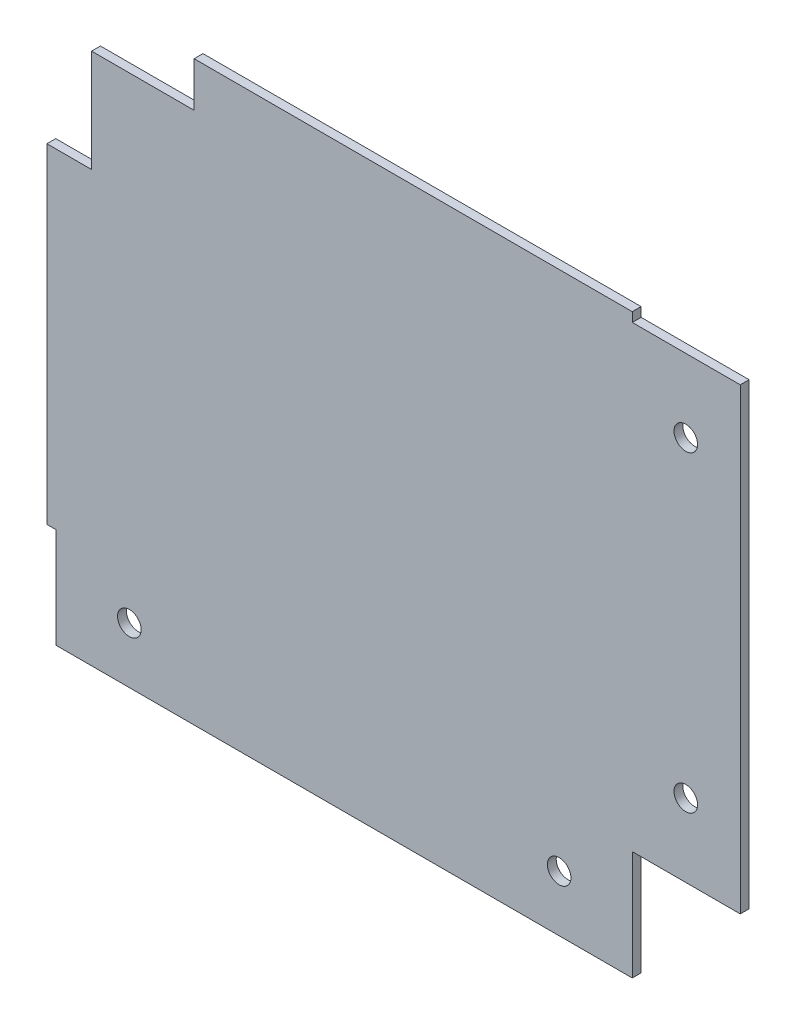
ISO-10303-21;
HEADER;
FILE_DESCRIPTION(('STEP AP214'),'2;1');
FILE_NAME('part.step','',(''),(''),'','','');
FILE_SCHEMA(('AUTOMOTIVE_DESIGN { 1 0 10303 214 1 1 1 1 }'));
ENDSEC;
DATA;
#1=APPLICATION_CONTEXT('core data for automotive mechanical design processes');
#2=APPLICATION_PROTOCOL_DEFINITION('international standard','automotive_design',2000,#1);
#3=PRODUCT_CONTEXT('',#1,'mechanical');
#4=PRODUCT('Part','Part','',(#3));
#5=PRODUCT_RELATED_PRODUCT_CATEGORY('part','',(#4));
#6=PRODUCT_DEFINITION_FORMATION('','',#4);
#7=PRODUCT_DEFINITION_CONTEXT('part definition',#1,'design');
#8=PRODUCT_DEFINITION('design','',#6,#7);
#9=PRODUCT_DEFINITION_SHAPE('','',#8);
#10=(LENGTH_UNIT() NAMED_UNIT(*) SI_UNIT(.MILLI.,.METRE.));
#11=(NAMED_UNIT(*) PLANE_ANGLE_UNIT() SI_UNIT($,.RADIAN.));
#12=(NAMED_UNIT(*) SI_UNIT($,.STERADIAN.) SOLID_ANGLE_UNIT());
#13=UNCERTAINTY_MEASURE_WITH_UNIT(LENGTH_MEASURE(1.E-05),#10,'distance_accuracy_value','');
#14=(GEOMETRIC_REPRESENTATION_CONTEXT(3) GLOBAL_UNCERTAINTY_ASSIGNED_CONTEXT((#13)) GLOBAL_UNIT_ASSIGNED_CONTEXT((#10,
#11,#12)) REPRESENTATION_CONTEXT('',''));
#15=CARTESIAN_POINT('',(0.,0.,0.));
#16=DIRECTION('',(0.,0.,1.));
#17=DIRECTION('',(1.,0.,0.));
#18=AXIS2_PLACEMENT_3D('',#15,#16,#17);
#19=CARTESIAN_POINT('',(0.,0.,3.));
#20=DIRECTION('',(0.,0.,-1.));
#21=DIRECTION('',(-1.,0.,0.));
#22=AXIS2_PLACEMENT_3D('',#19,#20,#21);
#23=PLANE('',#22);
#24=DIRECTION('',(0.,-1.,0.));
#25=VECTOR('',#24,1.);
#26=CARTESIAN_POINT('',(0.,0.,3.));
#27=LINE('',#26,#25);
#28=CARTESIAN_POINT('',(0.,34.005,3.));
#29=VERTEX_POINT('',#28);
#30=CARTESIAN_POINT('',(0.,0.,3.));
#31=VERTEX_POINT('',#30);
#32=EDGE_CURVE('E194',#29,#31,#27,.T.);
#33=ORIENTED_EDGE('',*,*,#32,.T.);
#34=DIRECTION('',(1.,0.,0.));
#35=VECTOR('',#34,1.);
#36=CARTESIAN_POINT('',(0.,0.,3.));
#37=LINE('',#36,#35);
#38=CARTESIAN_POINT('',(195.645,0.,3.));
#39=VERTEX_POINT('',#38);
#40=EDGE_CURVE('E112',#31,#39,#37,.T.);
#41=ORIENTED_EDGE('',*,*,#40,.T.);
#42=DIRECTION('',(0.,1.,0.));
#43=VECTOR('',#42,1.);
#44=CARTESIAN_POINT('',(195.645,0.,3.));
#45=LINE('',#44,#43);
#46=CARTESIAN_POINT('',(195.645,37.18,3.));
#47=VERTEX_POINT('',#46);
#48=EDGE_CURVE('E227',#39,#47,#45,.T.);
#49=ORIENTED_EDGE('',*,*,#48,.T.);
#50=DIRECTION('',(1.,0.,0.));
#51=VECTOR('',#50,1.);
#52=CARTESIAN_POINT('',(195.645,37.18,3.));
#53=LINE('',#52,#51);
#54=CARTESIAN_POINT('',(232.325,37.18,3.));
#55=VERTEX_POINT('',#54);
#56=EDGE_CURVE('E246',#47,#55,#53,.T.);
#57=ORIENTED_EDGE('',*,*,#56,.T.);
#58=DIRECTION('',(0.,1.,0.));
#59=VECTOR('',#58,1.);
#60=CARTESIAN_POINT('',(232.325,37.18,3.));
#61=LINE('',#60,#59);
#62=CARTESIAN_POINT('',(232.325,192.825,3.));
#63=VERTEX_POINT('',#62);
#64=EDGE_CURVE('E243',#55,#63,#61,.T.);
#65=ORIENTED_EDGE('',*,*,#64,.T.);
#66=DIRECTION('',(-1.,0.,0.));
#67=VECTOR('',#66,1.);
#68=CARTESIAN_POINT('',(232.325,192.825,3.));
#69=LINE('',#68,#67);
#70=CARTESIAN_POINT('',(195.645,192.825,3.));
#71=VERTEX_POINT('',#70);
#72=EDGE_CURVE('E245',#63,#71,#69,.T.);
#73=ORIENTED_EDGE('',*,*,#72,.T.);
#74=DIRECTION('',(0.,1.,0.));
#75=VECTOR('',#74,1.);
#76=CARTESIAN_POINT('',(195.645,192.825,3.));
#77=LINE('',#76,#75);
#78=CARTESIAN_POINT('',(195.645,196.,3.));
#79=VERTEX_POINT('',#78);
#80=EDGE_CURVE('E248',#71,#79,#77,.T.);
#81=ORIENTED_EDGE('',*,*,#80,.T.);
#82=DIRECTION('',(-1.,0.,0.));
#83=VECTOR('',#82,1.);
#84=CARTESIAN_POINT('',(46.835,196.,3.));
#85=LINE('',#84,#83);
#86=CARTESIAN_POINT('',(46.835,196.,3.));
#87=VERTEX_POINT('',#86);
#88=EDGE_CURVE('E254',#79,#87,#85,.T.);
#89=ORIENTED_EDGE('',*,*,#88,.T.);
#90=DIRECTION('',(0.,-1.,0.));
#91=VECTOR('',#90,1.);
#92=CARTESIAN_POINT('',(46.835,196.,3.));
#93=LINE('',#92,#91);
#94=CARTESIAN_POINT('',(46.835,180.82,3.));
#95=VERTEX_POINT('',#94);
#96=EDGE_CURVE('E256',#87,#95,#93,.T.);
#97=ORIENTED_EDGE('',*,*,#96,.T.);
#98=DIRECTION('',(-1.,0.,0.));
#99=VECTOR('',#98,1.);
#100=CARTESIAN_POINT('',(46.835,180.82,3.));
#101=LINE('',#100,#99);
#102=CARTESIAN_POINT('',(12.005,180.82,3.));
#103=VERTEX_POINT('',#102);
#104=EDGE_CURVE('E258',#95,#103,#101,.T.);
#105=ORIENTED_EDGE('',*,*,#104,.T.);
#106=DIRECTION('',(0.,-1.,0.));
#107=VECTOR('',#106,1.);
#108=CARTESIAN_POINT('',(12.005,180.82,3.));
#109=LINE('',#108,#107);
#110=CARTESIAN_POINT('',(12.005,145.99,3.));
#111=VERTEX_POINT('',#110);
#112=EDGE_CURVE('E149',#103,#111,#109,.T.);
#113=ORIENTED_EDGE('',*,*,#112,.T.);
#114=DIRECTION('',(-1.,0.,0.));
#115=VECTOR('',#114,1.);
#116=CARTESIAN_POINT('',(-3.175,145.99,3.));
#117=LINE('',#116,#115);
#118=CARTESIAN_POINT('',(-3.175,145.99,3.));
#119=VERTEX_POINT('',#118);
#120=EDGE_CURVE('E143',#111,#119,#117,.T.);
#121=ORIENTED_EDGE('',*,*,#120,.T.);
#122=DIRECTION('',(0.,-1.,0.));
#123=VECTOR('',#122,1.);
#124=CARTESIAN_POINT('',(-3.175,34.005,3.));
#125=LINE('',#124,#123);
#126=CARTESIAN_POINT('',(-3.175,34.005,3.));
#127=VERTEX_POINT('',#126);
#128=EDGE_CURVE('E147',#119,#127,#125,.T.);
#129=ORIENTED_EDGE('',*,*,#128,.T.);
#130=DIRECTION('',(1.,0.,0.));
#131=VECTOR('',#130,1.);
#132=CARTESIAN_POINT('',(-3.175,34.005,3.));
#133=LINE('',#132,#131);
#134=EDGE_CURVE('E51',#127,#29,#133,.T.);
#135=ORIENTED_EDGE('',*,*,#134,.T.);
#136=EDGE_LOOP('',(#33,#41,#49,#57,#65,#73,#81,#89,#97,#105,#113,#121,#129,#135));
#137=FACE_BOUND('',#136,.T.);
#138=CARTESIAN_POINT('',(170.815,19.005,3.));
#139=DIRECTION('',(0.,0.,1.));
#140=DIRECTION('',(1.,0.,0.));
#141=AXIS2_PLACEMENT_3D('',#138,#139,#140);
#142=CIRCLE('',#141,3.99999999999999);
#143=CARTESIAN_POINT('',(174.815,19.005,3.));
#144=VERTEX_POINT('',#143);
#145=EDGE_CURVE('E171',#144,#144,#142,.T.);
#146=ORIENTED_EDGE('',*,*,#145,.F.);
#147=EDGE_LOOP('',(#146));
#148=FACE_BOUND('',#147,.T.);
#149=CARTESIAN_POINT('',(24.83,19.005,3.));
#150=DIRECTION('',(0.,0.,1.));
#151=DIRECTION('',(1.,0.,0.));
#152=AXIS2_PLACEMENT_3D('',#149,#150,#151);
#153=CIRCLE('',#152,4.);
#154=CARTESIAN_POINT('',(28.83,19.005,3.));
#155=VERTEX_POINT('',#154);
#156=EDGE_CURVE('E322',#155,#155,#153,.T.);
#157=ORIENTED_EDGE('',*,*,#156,.F.);
#158=EDGE_LOOP('',(#157));
#159=FACE_BOUND('',#158,.T.);
#160=CARTESIAN_POINT('',(213.82,167.995,3.));
#161=DIRECTION('',(0.,0.,1.));
#162=DIRECTION('',(1.,0.,0.));
#163=AXIS2_PLACEMENT_3D('',#160,#161,#162);
#164=CIRCLE('',#163,3.99999999999999);
#165=CARTESIAN_POINT('',(217.82,167.995,3.));
#166=VERTEX_POINT('',#165);
#167=EDGE_CURVE('E316',#166,#166,#164,.T.);
#168=ORIENTED_EDGE('',*,*,#167,.F.);
#169=EDGE_LOOP('',(#168));
#170=FACE_BOUND('',#169,.T.);
#171=CARTESIAN_POINT('',(213.82,62.01,3.));
#172=DIRECTION('',(0.,0.,1.));
#173=DIRECTION('',(1.,0.,0.));
#174=AXIS2_PLACEMENT_3D('',#171,#172,#173);
#175=CIRCLE('',#174,3.99999999999999);
#176=CARTESIAN_POINT('',(217.82,62.01,3.));
#177=VERTEX_POINT('',#176);
#178=EDGE_CURVE('E307',#177,#177,#175,.T.);
#179=ORIENTED_EDGE('',*,*,#178,.F.);
#180=EDGE_LOOP('',(#179));
#181=FACE_BOUND('',#180,.T.);
#182=ADVANCED_FACE('F34',(#137,#148,#159,#170,#181),#23,.F.);
#183=CARTESIAN_POINT('',(0.,0.,0.));
#184=DIRECTION('',(0.,0.,-1.));
#185=DIRECTION('',(-1.,0.,0.));
#186=AXIS2_PLACEMENT_3D('',#183,#184,#185);
#187=PLANE('',#186);
#188=CARTESIAN_POINT('',(213.82,167.995,0.));
#189=DIRECTION('',(0.,0.,1.));
#190=DIRECTION('',(1.,0.,0.));
#191=AXIS2_PLACEMENT_3D('',#188,#189,#190);
#192=CIRCLE('',#191,3.99999999999999);
#193=CARTESIAN_POINT('',(217.82,167.995,0.));
#194=VERTEX_POINT('',#193);
#195=EDGE_CURVE('E313',#194,#194,#192,.T.);
#196=ORIENTED_EDGE('',*,*,#195,.T.);
#197=EDGE_LOOP('',(#196));
#198=FACE_BOUND('',#197,.T.);
#199=CARTESIAN_POINT('',(170.815,19.005,0.));
#200=DIRECTION('',(0.,0.,1.));
#201=DIRECTION('',(1.,0.,0.));
#202=AXIS2_PLACEMENT_3D('',#199,#200,#201);
#203=CIRCLE('',#202,3.99999999999999);
#204=CARTESIAN_POINT('',(174.815,19.005,0.));
#205=VERTEX_POINT('',#204);
#206=EDGE_CURVE('E325',#205,#205,#203,.T.);
#207=ORIENTED_EDGE('',*,*,#206,.T.);
#208=EDGE_LOOP('',(#207));
#209=FACE_BOUND('',#208,.T.);
#210=DIRECTION('',(0.,-1.,0.));
#211=VECTOR('',#210,1.);
#212=CARTESIAN_POINT('',(0.,0.,0.));
#213=LINE('',#212,#211);
#214=CARTESIAN_POINT('',(0.,34.005,0.));
#215=VERTEX_POINT('',#214);
#216=CARTESIAN_POINT('',(0.,0.,0.));
#217=VERTEX_POINT('',#216);
#218=EDGE_CURVE('E167',#215,#217,#213,.T.);
#219=ORIENTED_EDGE('',*,*,#218,.F.);
#220=DIRECTION('',(1.,0.,0.));
#221=VECTOR('',#220,1.);
#222=CARTESIAN_POINT('',(-3.175,34.005,0.));
#223=LINE('',#222,#221);
#224=CARTESIAN_POINT('',(-3.175,34.005,0.));
#225=VERTEX_POINT('',#224);
#226=EDGE_CURVE('E104',#225,#215,#223,.T.);
#227=ORIENTED_EDGE('',*,*,#226,.F.);
#228=DIRECTION('',(0.,-1.,0.));
#229=VECTOR('',#228,1.);
#230=CARTESIAN_POINT('',(-3.175,34.005,0.));
#231=LINE('',#230,#229);
#232=CARTESIAN_POINT('',(-3.175,145.99,0.));
#233=VERTEX_POINT('',#232);
#234=EDGE_CURVE('E98',#233,#225,#231,.T.);
#235=ORIENTED_EDGE('',*,*,#234,.F.);
#236=DIRECTION('',(-1.,0.,0.));
#237=VECTOR('',#236,1.);
#238=CARTESIAN_POINT('',(-3.175,145.99,0.));
#239=LINE('',#238,#237);
#240=CARTESIAN_POINT('',(12.005,145.99,0.));
#241=VERTEX_POINT('',#240);
#242=EDGE_CURVE('E157',#241,#233,#239,.T.);
#243=ORIENTED_EDGE('',*,*,#242,.F.);
#244=DIRECTION('',(0.,-1.,0.));
#245=VECTOR('',#244,1.);
#246=CARTESIAN_POINT('',(12.005,180.82,0.));
#247=LINE('',#246,#245);
#248=CARTESIAN_POINT('',(12.005,180.82,0.));
#249=VERTEX_POINT('',#248);
#250=EDGE_CURVE('E189',#249,#241,#247,.T.);
#251=ORIENTED_EDGE('',*,*,#250,.F.);
#252=DIRECTION('',(-1.,0.,0.));
#253=VECTOR('',#252,1.);
#254=CARTESIAN_POINT('',(46.835,180.82,0.));
#255=LINE('',#254,#253);
#256=CARTESIAN_POINT('',(46.835,180.82,0.));
#257=VERTEX_POINT('',#256);
#258=EDGE_CURVE('E187',#257,#249,#255,.T.);
#259=ORIENTED_EDGE('',*,*,#258,.F.);
#260=DIRECTION('',(0.,-1.,0.));
#261=VECTOR('',#260,1.);
#262=CARTESIAN_POINT('',(46.835,196.,0.));
#263=LINE('',#262,#261);
#264=CARTESIAN_POINT('',(46.835,196.,0.));
#265=VERTEX_POINT('',#264);
#266=EDGE_CURVE('E185',#265,#257,#263,.T.);
#267=ORIENTED_EDGE('',*,*,#266,.F.);
#268=DIRECTION('',(-1.,0.,0.));
#269=VECTOR('',#268,1.);
#270=CARTESIAN_POINT('',(46.835,196.,0.));
#271=LINE('',#270,#269);
#272=CARTESIAN_POINT('',(195.645,196.,0.));
#273=VERTEX_POINT('',#272);
#274=EDGE_CURVE('E183',#273,#265,#271,.T.);
#275=ORIENTED_EDGE('',*,*,#274,.F.);
#276=DIRECTION('',(0.,1.,0.));
#277=VECTOR('',#276,1.);
#278=CARTESIAN_POINT('',(195.645,192.825,0.));
#279=LINE('',#278,#277);
#280=CARTESIAN_POINT('',(195.645,192.825,0.));
#281=VERTEX_POINT('',#280);
#282=EDGE_CURVE('E181',#281,#273,#279,.T.);
#283=ORIENTED_EDGE('',*,*,#282,.F.);
#284=DIRECTION('',(-1.,0.,0.));
#285=VECTOR('',#284,1.);
#286=CARTESIAN_POINT('',(232.325,192.825,0.));
#287=LINE('',#286,#285);
#288=CARTESIAN_POINT('',(232.325,192.825,0.));
#289=VERTEX_POINT('',#288);
#290=EDGE_CURVE('E179',#289,#281,#287,.T.);
#291=ORIENTED_EDGE('',*,*,#290,.F.);
#292=DIRECTION('',(0.,1.,0.));
#293=VECTOR('',#292,1.);
#294=CARTESIAN_POINT('',(232.325,37.18,0.));
#295=LINE('',#294,#293);
#296=CARTESIAN_POINT('',(232.325,37.18,0.));
#297=VERTEX_POINT('',#296);
#298=EDGE_CURVE('E177',#297,#289,#295,.T.);
#299=ORIENTED_EDGE('',*,*,#298,.F.);
#300=DIRECTION('',(1.,0.,0.));
#301=VECTOR('',#300,1.);
#302=CARTESIAN_POINT('',(195.645,37.18,0.));
#303=LINE('',#302,#301);
#304=CARTESIAN_POINT('',(195.645,37.18,0.));
#305=VERTEX_POINT('',#304);
#306=EDGE_CURVE('E175',#305,#297,#303,.T.);
#307=ORIENTED_EDGE('',*,*,#306,.F.);
#308=DIRECTION('',(0.,1.,0.));
#309=VECTOR('',#308,1.);
#310=CARTESIAN_POINT('',(195.645,0.,0.));
#311=LINE('',#310,#309);
#312=CARTESIAN_POINT('',(195.645,0.,0.));
#313=VERTEX_POINT('',#312);
#314=EDGE_CURVE('E173',#313,#305,#311,.T.);
#315=ORIENTED_EDGE('',*,*,#314,.F.);
#316=DIRECTION('',(1.,0.,0.));
#317=VECTOR('',#316,1.);
#318=CARTESIAN_POINT('',(0.,0.,0.));
#319=LINE('',#318,#317);
#320=EDGE_CURVE('E170',#217,#313,#319,.T.);
#321=ORIENTED_EDGE('',*,*,#320,.F.);
#322=EDGE_LOOP('',(#219,#227,#235,#243,#251,#259,#267,#275,#283,#291,#299,#307,#315,#321));
#323=FACE_BOUND('',#322,.T.);
#324=CARTESIAN_POINT('',(24.83,19.005,0.));
#325=DIRECTION('',(0.,0.,1.));
#326=DIRECTION('',(1.,0.,0.));
#327=AXIS2_PLACEMENT_3D('',#324,#325,#326);
#328=CIRCLE('',#327,4.);
#329=CARTESIAN_POINT('',(28.83,19.005,0.));
#330=VERTEX_POINT('',#329);
#331=EDGE_CURVE('E319',#330,#330,#328,.T.);
#332=ORIENTED_EDGE('',*,*,#331,.T.);
#333=EDGE_LOOP('',(#332));
#334=FACE_BOUND('',#333,.T.);
#335=CARTESIAN_POINT('',(213.82,62.01,0.));
#336=DIRECTION('',(0.,0.,1.));
#337=DIRECTION('',(1.,0.,0.));
#338=AXIS2_PLACEMENT_3D('',#335,#336,#337);
#339=CIRCLE('',#338,3.99999999999999);
#340=CARTESIAN_POINT('',(217.82,62.01,0.));
#341=VERTEX_POINT('',#340);
#342=EDGE_CURVE('E310',#341,#341,#339,.T.);
#343=ORIENTED_EDGE('',*,*,#342,.T.);
#344=EDGE_LOOP('',(#343));
#345=FACE_BOUND('',#344,.T.);
#346=ADVANCED_FACE('F231',(#198,#209,#323,#334,#345),#187,.T.);
#347=CARTESIAN_POINT('',(0.,0.,3.));
#348=DIRECTION('',(1.,0.,0.));
#349=DIRECTION('',(0.,0.,-1.));
#350=AXIS2_PLACEMENT_3D('',#347,#348,#349);
#351=PLANE('',#350);
#352=ORIENTED_EDGE('',*,*,#218,.T.);
#353=DIRECTION('',(0.,0.,-1.));
#354=VECTOR('',#353,1.);
#355=CARTESIAN_POINT('',(0.,0.,3.));
#356=LINE('',#355,#354);
#357=EDGE_CURVE('E11',#31,#217,#356,.T.);
#358=ORIENTED_EDGE('',*,*,#357,.F.);
#359=ORIENTED_EDGE('',*,*,#32,.F.);
#360=DIRECTION('',(0.,0.,-1.));
#361=VECTOR('',#360,1.);
#362=CARTESIAN_POINT('',(0.,34.005,3.));
#363=LINE('',#362,#361);
#364=EDGE_CURVE('E163',#29,#215,#363,.T.);
#365=ORIENTED_EDGE('',*,*,#364,.T.);
#366=EDGE_LOOP('',(#352,#358,#359,#365));
#367=FACE_BOUND('',#366,.T.);
#368=ADVANCED_FACE('F36',(#367),#351,.F.);
#369=CARTESIAN_POINT('',(0.,0.,3.));
#370=DIRECTION('',(0.,1.,0.));
#371=DIRECTION('',(0.,0.,1.));
#372=AXIS2_PLACEMENT_3D('',#369,#370,#371);
#373=PLANE('',#372);
#374=ORIENTED_EDGE('',*,*,#320,.T.);
#375=DIRECTION('',(0.,0.,-1.));
#376=VECTOR('',#375,1.);
#377=CARTESIAN_POINT('',(195.645,0.,3.));
#378=LINE('',#377,#376);
#379=EDGE_CURVE('E43',#39,#313,#378,.T.);
#380=ORIENTED_EDGE('',*,*,#379,.F.);
#381=ORIENTED_EDGE('',*,*,#40,.F.);
#382=ORIENTED_EDGE('',*,*,#357,.T.);
#383=EDGE_LOOP('',(#374,#380,#381,#382));
#384=FACE_BOUND('',#383,.T.);
#385=ADVANCED_FACE('F457',(#384),#373,.F.);
#386=CARTESIAN_POINT('',(195.645,0.,3.));
#387=DIRECTION('',(-1.,0.,0.));
#388=DIRECTION('',(0.,0.,1.));
#389=AXIS2_PLACEMENT_3D('',#386,#387,#388);
#390=PLANE('',#389);
#391=ORIENTED_EDGE('',*,*,#314,.T.);
#392=DIRECTION('',(0.,0.,-1.));
#393=VECTOR('',#392,1.);
#394=CARTESIAN_POINT('',(195.645,37.18,3.));
#395=LINE('',#394,#393);
#396=EDGE_CURVE('E219',#47,#305,#395,.T.);
#397=ORIENTED_EDGE('',*,*,#396,.F.);
#398=ORIENTED_EDGE('',*,*,#48,.F.);
#399=ORIENTED_EDGE('',*,*,#379,.T.);
#400=EDGE_LOOP('',(#391,#397,#398,#399));
#401=FACE_BOUND('',#400,.T.);
#402=ADVANCED_FACE('F225',(#401),#390,.F.);
#403=CARTESIAN_POINT('',(195.645,37.18,3.));
#404=DIRECTION('',(0.,1.,0.));
#405=DIRECTION('',(0.,0.,1.));
#406=AXIS2_PLACEMENT_3D('',#403,#404,#405);
#407=PLANE('',#406);
#408=ORIENTED_EDGE('',*,*,#306,.T.);
#409=DIRECTION('',(0.,0.,-1.));
#410=VECTOR('',#409,1.);
#411=CARTESIAN_POINT('',(232.325,37.18,3.));
#412=LINE('',#411,#410);
#413=EDGE_CURVE('E216',#55,#297,#412,.T.);
#414=ORIENTED_EDGE('',*,*,#413,.F.);
#415=ORIENTED_EDGE('',*,*,#56,.F.);
#416=ORIENTED_EDGE('',*,*,#396,.T.);
#417=EDGE_LOOP('',(#408,#414,#415,#416));
#418=FACE_BOUND('',#417,.T.);
#419=ADVANCED_FACE('F237',(#418),#407,.F.);
#420=CARTESIAN_POINT('',(232.325,37.18,3.));
#421=DIRECTION('',(-1.,0.,0.));
#422=DIRECTION('',(0.,-1.,0.));
#423=AXIS2_PLACEMENT_3D('',#420,#421,#422);
#424=PLANE('',#423);
#425=ORIENTED_EDGE('',*,*,#298,.T.);
#426=DIRECTION('',(0.,0.,-1.));
#427=VECTOR('',#426,1.);
#428=CARTESIAN_POINT('',(232.325,192.825,3.));
#429=LINE('',#428,#427);
#430=EDGE_CURVE('E213',#63,#289,#429,.T.);
#431=ORIENTED_EDGE('',*,*,#430,.F.);
#432=ORIENTED_EDGE('',*,*,#64,.F.);
#433=ORIENTED_EDGE('',*,*,#413,.T.);
#434=EDGE_LOOP('',(#425,#431,#432,#433));
#435=FACE_BOUND('',#434,.T.);
#436=ADVANCED_FACE('F241',(#435),#424,.F.);
#437=CARTESIAN_POINT('',(232.325,192.825,3.));
#438=DIRECTION('',(0.,-1.,0.));
#439=DIRECTION('',(0.,0.,-1.));
#440=AXIS2_PLACEMENT_3D('',#437,#438,#439);
#441=PLANE('',#440);
#442=ORIENTED_EDGE('',*,*,#290,.T.);
#443=DIRECTION('',(0.,0.,-1.));
#444=VECTOR('',#443,1.);
#445=CARTESIAN_POINT('',(195.645,192.825,3.));
#446=LINE('',#445,#444);
#447=EDGE_CURVE('E210',#71,#281,#446,.T.);
#448=ORIENTED_EDGE('',*,*,#447,.F.);
#449=ORIENTED_EDGE('',*,*,#72,.F.);
#450=ORIENTED_EDGE('',*,*,#430,.T.);
#451=EDGE_LOOP('',(#442,#448,#449,#450));
#452=FACE_BOUND('',#451,.T.);
#453=ADVANCED_FACE('F422',(#452),#441,.F.);
#454=CARTESIAN_POINT('',(195.645,192.825,3.));
#455=DIRECTION('',(-1.,0.,0.));
#456=DIRECTION('',(0.,-1.,0.));
#457=AXIS2_PLACEMENT_3D('',#454,#455,#456);
#458=PLANE('',#457);
#459=ORIENTED_EDGE('',*,*,#282,.T.);
#460=DIRECTION('',(0.,0.,-1.));
#461=VECTOR('',#460,1.);
#462=CARTESIAN_POINT('',(195.645,196.,3.));
#463=LINE('',#462,#461);
#464=EDGE_CURVE('E207',#79,#273,#463,.T.);
#465=ORIENTED_EDGE('',*,*,#464,.F.);
#466=ORIENTED_EDGE('',*,*,#80,.F.);
#467=ORIENTED_EDGE('',*,*,#447,.T.);
#468=EDGE_LOOP('',(#459,#465,#466,#467));
#469=FACE_BOUND('',#468,.T.);
#470=ADVANCED_FACE('F412',(#469),#458,.F.);
#471=CARTESIAN_POINT('',(46.835,196.,3.));
#472=DIRECTION('',(0.,-1.,0.));
#473=DIRECTION('',(0.,0.,-1.));
#474=AXIS2_PLACEMENT_3D('',#471,#472,#473);
#475=PLANE('',#474);
#476=ORIENTED_EDGE('',*,*,#274,.T.);
#477=DIRECTION('',(0.,0.,-1.));
#478=VECTOR('',#477,1.);
#479=CARTESIAN_POINT('',(46.835,196.,3.));
#480=LINE('',#479,#478);
#481=EDGE_CURVE('E204',#87,#265,#480,.T.);
#482=ORIENTED_EDGE('',*,*,#481,.F.);
#483=ORIENTED_EDGE('',*,*,#88,.F.);
#484=ORIENTED_EDGE('',*,*,#464,.T.);
#485=EDGE_LOOP('',(#476,#482,#483,#484));
#486=FACE_BOUND('',#485,.T.);
#487=ADVANCED_FACE('F402',(#486),#475,.F.);
#488=CARTESIAN_POINT('',(46.835,196.,3.));
#489=DIRECTION('',(1.,0.,0.));
#490=DIRECTION('',(0.,0.,-1.));
#491=AXIS2_PLACEMENT_3D('',#488,#489,#490);
#492=PLANE('',#491);
#493=ORIENTED_EDGE('',*,*,#266,.T.);
#494=DIRECTION('',(0.,0.,-1.));
#495=VECTOR('',#494,1.);
#496=CARTESIAN_POINT('',(46.835,180.82,3.));
#497=LINE('',#496,#495);
#498=EDGE_CURVE('E201',#95,#257,#497,.T.);
#499=ORIENTED_EDGE('',*,*,#498,.F.);
#500=ORIENTED_EDGE('',*,*,#96,.F.);
#501=ORIENTED_EDGE('',*,*,#481,.T.);
#502=EDGE_LOOP('',(#493,#499,#500,#501));
#503=FACE_BOUND('',#502,.T.);
#504=ADVANCED_FACE('F393',(#503),#492,.F.);
#505=CARTESIAN_POINT('',(46.835,180.82,3.));
#506=DIRECTION('',(0.,-1.,0.));
#507=DIRECTION('',(0.,0.,-1.));
#508=AXIS2_PLACEMENT_3D('',#505,#506,#507);
#509=PLANE('',#508);
#510=ORIENTED_EDGE('',*,*,#258,.T.);
#511=DIRECTION('',(0.,0.,-1.));
#512=VECTOR('',#511,1.);
#513=CARTESIAN_POINT('',(12.005,180.82,3.));
#514=LINE('',#513,#512);
#515=EDGE_CURVE('E198',#103,#249,#514,.T.);
#516=ORIENTED_EDGE('',*,*,#515,.F.);
#517=ORIENTED_EDGE('',*,*,#104,.F.);
#518=ORIENTED_EDGE('',*,*,#498,.T.);
#519=EDGE_LOOP('',(#510,#516,#517,#518));
#520=FACE_BOUND('',#519,.T.);
#521=ADVANCED_FACE('F264',(#520),#509,.F.);
#522=CARTESIAN_POINT('',(12.005,180.82,3.));
#523=DIRECTION('',(1.,0.,0.));
#524=DIRECTION('',(0.,1.,0.));
#525=AXIS2_PLACEMENT_3D('',#522,#523,#524);
#526=PLANE('',#525);
#527=ORIENTED_EDGE('',*,*,#250,.T.);
#528=DIRECTION('',(0.,0.,-1.));
#529=VECTOR('',#528,1.);
#530=CARTESIAN_POINT('',(12.005,145.99,3.));
#531=LINE('',#530,#529);
#532=EDGE_CURVE('E158',#111,#241,#531,.T.);
#533=ORIENTED_EDGE('',*,*,#532,.F.);
#534=ORIENTED_EDGE('',*,*,#112,.F.);
#535=ORIENTED_EDGE('',*,*,#515,.T.);
#536=EDGE_LOOP('',(#527,#533,#534,#535));
#537=FACE_BOUND('',#536,.T.);
#538=ADVANCED_FACE('F268',(#537),#526,.F.);
#539=CARTESIAN_POINT('',(-3.175,145.99,3.));
#540=DIRECTION('',(0.,-1.,0.));
#541=DIRECTION('',(0.,0.,-1.));
#542=AXIS2_PLACEMENT_3D('',#539,#540,#541);
#543=PLANE('',#542);
#544=ORIENTED_EDGE('',*,*,#242,.T.);
#545=DIRECTION('',(0.,0.,-1.));
#546=VECTOR('',#545,1.);
#547=CARTESIAN_POINT('',(-3.175,145.99,3.));
#548=LINE('',#547,#546);
#549=EDGE_CURVE('E154',#119,#233,#548,.T.);
#550=ORIENTED_EDGE('',*,*,#549,.F.);
#551=ORIENTED_EDGE('',*,*,#120,.F.);
#552=ORIENTED_EDGE('',*,*,#532,.T.);
#553=EDGE_LOOP('',(#544,#550,#551,#552));
#554=FACE_BOUND('',#553,.T.);
#555=ADVANCED_FACE('F155',(#554),#543,.F.);
#556=CARTESIAN_POINT('',(-3.175,34.005,3.));
#557=DIRECTION('',(1.,0.,0.));
#558=DIRECTION('',(0.,0.,-1.));
#559=AXIS2_PLACEMENT_3D('',#556,#557,#558);
#560=PLANE('',#559);
#561=ORIENTED_EDGE('',*,*,#234,.T.);
#562=DIRECTION('',(0.,0.,-1.));
#563=VECTOR('',#562,1.);
#564=CARTESIAN_POINT('',(-3.175,34.005,3.));
#565=LINE('',#564,#563);
#566=EDGE_CURVE('E159',#127,#225,#565,.T.);
#567=ORIENTED_EDGE('',*,*,#566,.F.);
#568=ORIENTED_EDGE('',*,*,#128,.F.);
#569=ORIENTED_EDGE('',*,*,#549,.T.);
#570=EDGE_LOOP('',(#561,#567,#568,#569));
#571=FACE_BOUND('',#570,.T.);
#572=ADVANCED_FACE('F161',(#571),#560,.F.);
#573=CARTESIAN_POINT('',(-3.175,34.005,3.));
#574=DIRECTION('',(0.,1.,0.));
#575=DIRECTION('',(0.,0.,1.));
#576=AXIS2_PLACEMENT_3D('',#573,#574,#575);
#577=PLANE('',#576);
#578=ORIENTED_EDGE('',*,*,#226,.T.);
#579=ORIENTED_EDGE('',*,*,#364,.F.);
#580=ORIENTED_EDGE('',*,*,#134,.F.);
#581=ORIENTED_EDGE('',*,*,#566,.T.);
#582=EDGE_LOOP('',(#578,#579,#580,#581));
#583=FACE_BOUND('',#582,.T.);
#584=ADVANCED_FACE('F272',(#583),#577,.F.);
#585=CARTESIAN_POINT('',(170.815,19.005,3.));
#586=DIRECTION('',(0.,0.,-1.));
#587=DIRECTION('',(-1.,0.,0.));
#588=AXIS2_PLACEMENT_3D('',#585,#586,#587);
#589=CYLINDRICAL_SURFACE('',#588,3.99999999999999);
#590=ORIENTED_EDGE('',*,*,#145,.T.);
#591=EDGE_LOOP('',(#590));
#592=FACE_BOUND('',#591,.T.);
#593=ORIENTED_EDGE('',*,*,#206,.F.);
#594=EDGE_LOOP('',(#593));
#595=FACE_BOUND('',#594,.T.);
#596=ADVANCED_FACE('F274',(#592,#595),#589,.F.);
#597=CARTESIAN_POINT('',(24.83,19.005,3.));
#598=DIRECTION('',(0.,0.,-1.));
#599=DIRECTION('',(-1.,0.,0.));
#600=AXIS2_PLACEMENT_3D('',#597,#598,#599);
#601=CYLINDRICAL_SURFACE('',#600,4.);
#602=ORIENTED_EDGE('',*,*,#156,.T.);
#603=EDGE_LOOP('',(#602));
#604=FACE_BOUND('',#603,.T.);
#605=ORIENTED_EDGE('',*,*,#331,.F.);
#606=EDGE_LOOP('',(#605));
#607=FACE_BOUND('',#606,.T.);
#608=ADVANCED_FACE('F280',(#604,#607),#601,.F.);
#609=CARTESIAN_POINT('',(213.82,167.995,3.));
#610=DIRECTION('',(0.,0.,-1.));
#611=DIRECTION('',(-1.,0.,0.));
#612=AXIS2_PLACEMENT_3D('',#609,#610,#611);
#613=CYLINDRICAL_SURFACE('',#612,3.99999999999999);
#614=ORIENTED_EDGE('',*,*,#167,.T.);
#615=EDGE_LOOP('',(#614));
#616=FACE_BOUND('',#615,.T.);
#617=ORIENTED_EDGE('',*,*,#195,.F.);
#618=EDGE_LOOP('',(#617));
#619=FACE_BOUND('',#618,.T.);
#620=ADVANCED_FACE('F294',(#616,#619),#613,.F.);
#621=CARTESIAN_POINT('',(213.82,62.01,3.));
#622=DIRECTION('',(0.,0.,-1.));
#623=DIRECTION('',(-1.,0.,0.));
#624=AXIS2_PLACEMENT_3D('',#621,#622,#623);
#625=CYLINDRICAL_SURFACE('',#624,3.99999999999999);
#626=ORIENTED_EDGE('',*,*,#178,.T.);
#627=EDGE_LOOP('',(#626));
#628=FACE_BOUND('',#627,.T.);
#629=ORIENTED_EDGE('',*,*,#342,.F.);
#630=EDGE_LOOP('',(#629));
#631=FACE_BOUND('',#630,.T.);
#632=ADVANCED_FACE('F298',(#628,#631),#625,.F.);
#633=CLOSED_SHELL('',(#182,#346,#368,#385,#402,#419,#436,#453,#470,#487,#504,#521,#538,#555,
#572,#584,#596,#608,#620,#632));
#634=MANIFOLD_SOLID_BREP('B2',#633);
#635=ADVANCED_BREP_SHAPE_REPRESENTATION('',(#18,#634),#14);
#636=SHAPE_DEFINITION_REPRESENTATION(#9,#635);
ENDSEC;
END-ISO-10303-21;
